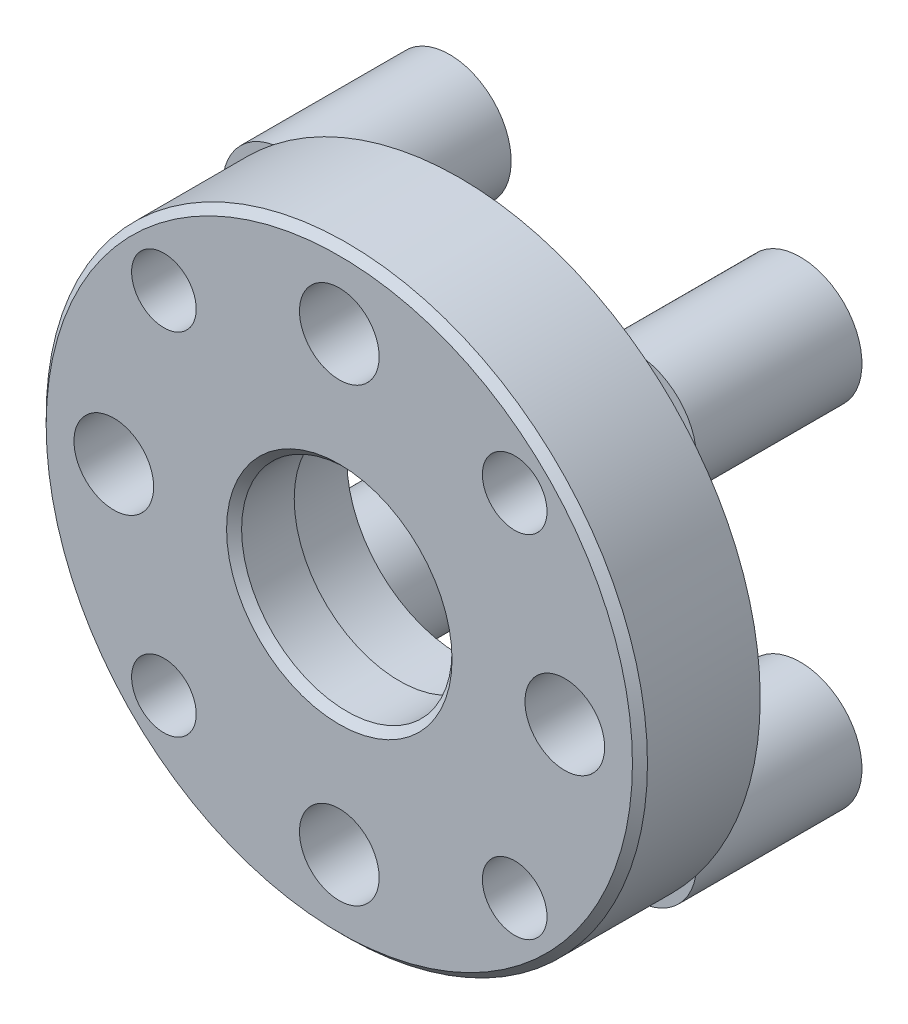
ISO-10303-21;
HEADER;
FILE_DESCRIPTION(('STEP AP214'),'2;1');
FILE_NAME('part.step','',(''),(''),'','','');
FILE_SCHEMA(('AUTOMOTIVE_DESIGN { 1 0 10303 214 1 1 1 1 }'));
ENDSEC;
DATA;
#1=APPLICATION_CONTEXT('core data for automotive mechanical design processes');
#2=APPLICATION_PROTOCOL_DEFINITION('international standard','automotive_design',2000,#1);
#3=PRODUCT_CONTEXT('',#1,'mechanical');
#4=PRODUCT('Part','Part','',(#3));
#5=PRODUCT_RELATED_PRODUCT_CATEGORY('part','',(#4));
#6=PRODUCT_DEFINITION_FORMATION('','',#4);
#7=PRODUCT_DEFINITION_CONTEXT('part definition',#1,'design');
#8=PRODUCT_DEFINITION('design','',#6,#7);
#9=PRODUCT_DEFINITION_SHAPE('','',#8);
#10=(LENGTH_UNIT() NAMED_UNIT(*) SI_UNIT(.MILLI.,.METRE.));
#11=(NAMED_UNIT(*) PLANE_ANGLE_UNIT() SI_UNIT($,.RADIAN.));
#12=(NAMED_UNIT(*) SI_UNIT($,.STERADIAN.) SOLID_ANGLE_UNIT());
#13=UNCERTAINTY_MEASURE_WITH_UNIT(LENGTH_MEASURE(1.E-05),#10,'distance_accuracy_value','');
#14=(GEOMETRIC_REPRESENTATION_CONTEXT(3) GLOBAL_UNCERTAINTY_ASSIGNED_CONTEXT((#13)) GLOBAL_UNIT_ASSIGNED_CONTEXT((#10,
#11,#12)) REPRESENTATION_CONTEXT('',''));
#15=CARTESIAN_POINT('',(0.,0.,0.));
#16=DIRECTION('',(0.,0.,1.));
#17=DIRECTION('',(1.,0.,0.));
#18=AXIS2_PLACEMENT_3D('',#15,#16,#17);
#19=CARTESIAN_POINT('',(0.,0.,33.2347367900408));
#20=DIRECTION('',(0.,0.,-1.));
#21=DIRECTION('',(-1.,0.,0.));
#22=AXIS2_PLACEMENT_3D('',#19,#20,#21);
#23=CYLINDRICAL_SURFACE('',#22,7.5);
#24=CARTESIAN_POINT('',(0.,0.,25.2347367900408));
#25=DIRECTION('',(0.,0.,1.));
#26=DIRECTION('',(1.,0.,0.));
#27=AXIS2_PLACEMENT_3D('',#24,#25,#26);
#28=CIRCLE('',#27,7.5);
#29=CARTESIAN_POINT('',(7.5,0.,25.2347367900408));
#30=VERTEX_POINT('',#29);
#31=EDGE_CURVE('E130',#30,#30,#28,.T.);
#32=ORIENTED_EDGE('',*,*,#31,.F.);
#33=EDGE_LOOP('',(#32));
#34=FACE_BOUND('',#33,.T.);
#35=CARTESIAN_POINT('',(0.,0.,29.2347367900408));
#36=DIRECTION('',(0.,0.,1.));
#37=DIRECTION('',(1.,0.,0.));
#38=AXIS2_PLACEMENT_3D('',#35,#36,#37);
#39=CIRCLE('',#38,7.5);
#40=CARTESIAN_POINT('',(7.5,0.,29.2347367900408));
#41=VERTEX_POINT('',#40);
#42=EDGE_CURVE('E342',#41,#41,#39,.T.);
#43=ORIENTED_EDGE('',*,*,#42,.T.);
#44=EDGE_LOOP('',(#43));
#45=FACE_BOUND('',#44,.T.);
#46=ADVANCED_FACE('F56',(#34,#45),#23,.F.);
#47=CARTESIAN_POINT('',(11.667261889578,-11.667261889578,14.2347367900408));
#48=DIRECTION('',(0.,0.,1.));
#49=DIRECTION('',(1.,0.,0.));
#50=AXIS2_PLACEMENT_3D('',#47,#48,#49);
#51=CYLINDRICAL_SURFACE('',#50,1.6);
#52=CARTESIAN_POINT('',(11.667261889578,-11.667261889578,17.2347367900408));
#53=DIRECTION('',(0.,0.,-1.));
#54=DIRECTION('',(-1.,0.,0.));
#55=AXIS2_PLACEMENT_3D('',#52,#53,#54);
#56=CIRCLE('',#55,1.6);
#57=CARTESIAN_POINT('',(10.067261889578,-11.667261889578,17.2347367900408));
#58=VERTEX_POINT('',#57);
#59=EDGE_CURVE('E133',#58,#58,#56,.F.);
#60=ORIENTED_EDGE('',*,*,#59,.F.);
#61=EDGE_LOOP('',(#60));
#62=FACE_BOUND('',#61,.T.);
#63=CARTESIAN_POINT('',(11.667261889578,-11.667261889578,25.2347367900408));
#64=DIRECTION('',(0.,0.,1.));
#65=DIRECTION('',(1.,0.,0.));
#66=AXIS2_PLACEMENT_3D('',#63,#64,#65);
#67=CIRCLE('',#66,1.6);
#68=CARTESIAN_POINT('',(13.267261889578,-11.667261889578,25.2347367900408));
#69=VERTEX_POINT('',#68);
#70=EDGE_CURVE('E115',#69,#69,#67,.F.);
#71=ORIENTED_EDGE('',*,*,#70,.F.);
#72=EDGE_LOOP('',(#71));
#73=FACE_BOUND('',#72,.T.);
#74=ADVANCED_FACE('F223',(#62,#73),#51,.F.);
#75=CARTESIAN_POINT('',(-11.667261889578,-11.667261889578,14.2347367900408));
#76=DIRECTION('',(0.,0.,1.));
#77=DIRECTION('',(1.,0.,0.));
#78=AXIS2_PLACEMENT_3D('',#75,#76,#77);
#79=CYLINDRICAL_SURFACE('',#78,1.6);
#80=CARTESIAN_POINT('',(-11.667261889578,-11.667261889578,17.2347367900408));
#81=DIRECTION('',(0.,0.,-1.));
#82=DIRECTION('',(-1.,0.,0.));
#83=AXIS2_PLACEMENT_3D('',#80,#81,#82);
#84=CIRCLE('',#83,1.6);
#85=CARTESIAN_POINT('',(-13.267261889578,-11.667261889578,17.2347367900408));
#86=VERTEX_POINT('',#85);
#87=EDGE_CURVE('E477',#86,#86,#84,.F.);
#88=ORIENTED_EDGE('',*,*,#87,.F.);
#89=EDGE_LOOP('',(#88));
#90=FACE_BOUND('',#89,.T.);
#91=CARTESIAN_POINT('',(-11.667261889578,-11.667261889578,25.2347367900408));
#92=DIRECTION('',(0.,0.,1.));
#93=DIRECTION('',(1.,0.,0.));
#94=AXIS2_PLACEMENT_3D('',#91,#92,#93);
#95=CIRCLE('',#94,1.6);
#96=CARTESIAN_POINT('',(-10.067261889578,-11.667261889578,25.2347367900408));
#97=VERTEX_POINT('',#96);
#98=EDGE_CURVE('E464',#97,#97,#95,.F.);
#99=ORIENTED_EDGE('',*,*,#98,.F.);
#100=EDGE_LOOP('',(#99));
#101=FACE_BOUND('',#100,.T.);
#102=ADVANCED_FACE('F231',(#90,#101),#79,.F.);
#103=CARTESIAN_POINT('',(-11.667261889578,11.667261889578,14.2347367900408));
#104=DIRECTION('',(0.,0.,1.));
#105=DIRECTION('',(1.,0.,0.));
#106=AXIS2_PLACEMENT_3D('',#103,#104,#105);
#107=CYLINDRICAL_SURFACE('',#106,1.6);
#108=CARTESIAN_POINT('',(-11.667261889578,11.667261889578,17.2347367900408));
#109=DIRECTION('',(0.,0.,-1.));
#110=DIRECTION('',(-1.,0.,0.));
#111=AXIS2_PLACEMENT_3D('',#108,#109,#110);
#112=CIRCLE('',#111,1.6);
#113=CARTESIAN_POINT('',(-13.267261889578,11.667261889578,17.2347367900408));
#114=VERTEX_POINT('',#113);
#115=EDGE_CURVE('E480',#114,#114,#112,.F.);
#116=ORIENTED_EDGE('',*,*,#115,.F.);
#117=EDGE_LOOP('',(#116));
#118=FACE_BOUND('',#117,.T.);
#119=CARTESIAN_POINT('',(-11.667261889578,11.667261889578,25.2347367900408));
#120=DIRECTION('',(0.,0.,1.));
#121=DIRECTION('',(1.,0.,0.));
#122=AXIS2_PLACEMENT_3D('',#119,#120,#121);
#123=CIRCLE('',#122,1.6);
#124=CARTESIAN_POINT('',(-10.067261889578,11.667261889578,25.2347367900408));
#125=VERTEX_POINT('',#124);
#126=EDGE_CURVE('E461',#125,#125,#123,.F.);
#127=ORIENTED_EDGE('',*,*,#126,.F.);
#128=EDGE_LOOP('',(#127));
#129=FACE_BOUND('',#128,.T.);
#130=ADVANCED_FACE('F447',(#118,#129),#107,.F.);
#131=CARTESIAN_POINT('',(11.667261889578,11.667261889578,14.2347367900408));
#132=DIRECTION('',(0.,0.,1.));
#133=DIRECTION('',(1.,0.,0.));
#134=AXIS2_PLACEMENT_3D('',#131,#132,#133);
#135=CYLINDRICAL_SURFACE('',#134,1.6);
#136=CARTESIAN_POINT('',(11.667261889578,11.667261889578,17.2347367900408));
#137=DIRECTION('',(0.,0.,-1.));
#138=DIRECTION('',(-1.,0.,0.));
#139=AXIS2_PLACEMENT_3D('',#136,#137,#138);
#140=CIRCLE('',#139,1.6);
#141=CARTESIAN_POINT('',(10.067261889578,11.667261889578,17.2347367900408));
#142=VERTEX_POINT('',#141);
#143=EDGE_CURVE('E181',#142,#142,#140,.F.);
#144=ORIENTED_EDGE('',*,*,#143,.F.);
#145=EDGE_LOOP('',(#144));
#146=FACE_BOUND('',#145,.T.);
#147=CARTESIAN_POINT('',(11.667261889578,11.667261889578,25.2347367900408));
#148=DIRECTION('',(0.,0.,1.));
#149=DIRECTION('',(1.,0.,0.));
#150=AXIS2_PLACEMENT_3D('',#147,#148,#149);
#151=CIRCLE('',#150,1.6);
#152=CARTESIAN_POINT('',(13.267261889578,11.667261889578,25.2347367900408));
#153=VERTEX_POINT('',#152);
#154=EDGE_CURVE('E313',#153,#153,#151,.F.);
#155=ORIENTED_EDGE('',*,*,#154,.F.);
#156=EDGE_LOOP('',(#155));
#157=FACE_BOUND('',#156,.T.);
#158=ADVANCED_FACE('F190',(#146,#157),#135,.F.);
#159=CARTESIAN_POINT('',(11.667261889578,11.667261889578,14.2347367900408));
#160=DIRECTION('',(0.,0.,-1.));
#161=DIRECTION('',(-1.,0.,0.));
#162=AXIS2_PLACEMENT_3D('',#159,#160,#161);
#163=PLANE('',#162);
#164=CARTESIAN_POINT('',(11.667261889578,11.667261889578,14.2347367900408));
#165=DIRECTION('',(0.,0.,-1.));
#166=DIRECTION('',(-1.,0.,0.));
#167=AXIS2_PLACEMENT_3D('',#164,#165,#166);
#168=CIRCLE('',#167,3.);
#169=CARTESIAN_POINT('',(8.66726188957803,11.667261889578,14.2347367900408));
#170=VERTEX_POINT('',#169);
#171=EDGE_CURVE('E163',#170,#170,#168,.T.);
#172=ORIENTED_EDGE('',*,*,#171,.F.);
#173=EDGE_LOOP('',(#172));
#174=FACE_BOUND('',#173,.T.);
#175=CARTESIAN_POINT('',(11.667261889578,11.667261889578,14.2347367900408));
#176=DIRECTION('',(0.,0.,-1.));
#177=DIRECTION('',(-1.,0.,0.));
#178=AXIS2_PLACEMENT_3D('',#175,#176,#177);
#179=CIRCLE('',#178,4.1);
#180=CARTESIAN_POINT('',(7.56726188957803,11.667261889578,14.2347367900408));
#181=VERTEX_POINT('',#180);
#182=EDGE_CURVE('E118',#181,#181,#179,.T.);
#183=ORIENTED_EDGE('',*,*,#182,.T.);
#184=EDGE_LOOP('',(#183));
#185=FACE_BOUND('',#184,.T.);
#186=ADVANCED_FACE('F187',(#174,#185),#163,.T.);
#187=CARTESIAN_POINT('',(11.667261889578,11.667261889578,25.2347367900408));
#188=DIRECTION('',(0.,0.,-1.));
#189=DIRECTION('',(-1.,0.,0.));
#190=AXIS2_PLACEMENT_3D('',#187,#188,#189);
#191=PLANE('',#190);
#192=CARTESIAN_POINT('',(0.,0.,25.2347367900408));
#193=DIRECTION('',(0.,0.,1.));
#194=DIRECTION('',(1.,0.,0.));
#195=AXIS2_PLACEMENT_3D('',#192,#193,#194);
#196=CIRCLE('',#195,20.);
#197=CARTESIAN_POINT('',(15.7039712173582,12.3848814287576,25.2347367900408));
#198=VERTEX_POINT('',#197);
#199=CARTESIAN_POINT('',(12.3848814287576,15.7039712173582,25.2347367900408));
#200=VERTEX_POINT('',#199);
#201=EDGE_CURVE('E95',#198,#200,#196,.T.);
#202=ORIENTED_EDGE('',*,*,#201,.F.);
#203=CARTESIAN_POINT('',(11.667261889578,11.667261889578,25.2347367900408));
#204=DIRECTION('',(0.,0.,-1.));
#205=DIRECTION('',(-1.,0.,0.));
#206=AXIS2_PLACEMENT_3D('',#203,#204,#205);
#207=CIRCLE('',#206,4.1);
#208=EDGE_CURVE('E113',#200,#198,#207,.T.);
#209=ORIENTED_EDGE('',*,*,#208,.F.);
#210=EDGE_LOOP('',(#202,#209));
#211=FACE_BOUND('',#210,.T.);
#212=ADVANCED_FACE('F117',(#211),#191,.F.);
#213=CARTESIAN_POINT('',(0.,0.,33.2347367900408));
#214=DIRECTION('',(0.,0.,1.));
#215=DIRECTION('',(1.,0.,0.));
#216=AXIS2_PLACEMENT_3D('',#213,#214,#215);
#217=PLANE('',#216);
#218=CARTESIAN_POINT('',(0.,0.,33.2347367900408));
#219=DIRECTION('',(0.,0.,1.));
#220=DIRECTION('',(1.,0.,0.));
#221=AXIS2_PLACEMENT_3D('',#218,#219,#220);
#222=CIRCLE('',#221,7.49999999999999);
#223=CARTESIAN_POINT('',(7.49999999999999,0.,33.2347367900408));
#224=VERTEX_POINT('',#223);
#225=EDGE_CURVE('E65',#224,#224,#222,.F.);
#226=ORIENTED_EDGE('',*,*,#225,.T.);
#227=EDGE_LOOP('',(#226));
#228=FACE_BOUND('',#227,.T.);
#229=CARTESIAN_POINT('',(0.,0.,33.2347367900408));
#230=DIRECTION('',(0.,0.,1.));
#231=DIRECTION('',(1.,0.,0.));
#232=AXIS2_PLACEMENT_3D('',#229,#230,#231);
#233=CIRCLE('',#232,19.5);
#234=CARTESIAN_POINT('',(19.5,0.,33.2347367900408));
#235=VERTEX_POINT('',#234);
#236=EDGE_CURVE('E271',#235,#235,#233,.T.);
#237=ORIENTED_EDGE('',*,*,#236,.T.);
#238=EDGE_LOOP('',(#237));
#239=FACE_BOUND('',#238,.T.);
#240=CARTESIAN_POINT('',(15.,0.,33.2347367900408));
#241=DIRECTION('',(0.,0.,1.));
#242=DIRECTION('',(1.,0.,0.));
#243=AXIS2_PLACEMENT_3D('',#240,#241,#242);
#244=CIRCLE('',#243,2.65);
#245=CARTESIAN_POINT('',(17.65,0.,33.2347367900408));
#246=VERTEX_POINT('',#245);
#247=EDGE_CURVE('E283',#246,#246,#244,.T.);
#248=ORIENTED_EDGE('',*,*,#247,.F.);
#249=EDGE_LOOP('',(#248));
#250=FACE_BOUND('',#249,.T.);
#251=CARTESIAN_POINT('',(-1.04744440165294E-13,-15.,33.2347367900408));
#252=DIRECTION('',(0.,0.,1.));
#253=DIRECTION('',(1.,0.,0.));
#254=AXIS2_PLACEMENT_3D('',#251,#252,#253);
#255=CIRCLE('',#254,2.65);
#256=CARTESIAN_POINT('',(2.64999999999989,-15.,33.2347367900408));
#257=VERTEX_POINT('',#256);
#258=EDGE_CURVE('E287',#257,#257,#255,.T.);
#259=ORIENTED_EDGE('',*,*,#258,.F.);
#260=EDGE_LOOP('',(#259));
#261=FACE_BOUND('',#260,.T.);
#262=CARTESIAN_POINT('',(-15.,1.57116660247941E-13,33.2347367900408));
#263=DIRECTION('',(0.,0.,1.));
#264=DIRECTION('',(1.,0.,0.));
#265=AXIS2_PLACEMENT_3D('',#262,#263,#264);
#266=CIRCLE('',#265,2.65);
#267=CARTESIAN_POINT('',(-12.35,1.57116660247941E-13,33.2347367900408));
#268=VERTEX_POINT('',#267);
#269=EDGE_CURVE('E291',#268,#268,#266,.T.);
#270=ORIENTED_EDGE('',*,*,#269,.F.);
#271=EDGE_LOOP('',(#270));
#272=FACE_BOUND('',#271,.T.);
#273=CARTESIAN_POINT('',(-11.667261889578,11.667261889578,33.2347367900408));
#274=DIRECTION('',(0.,0.,1.));
#275=DIRECTION('',(1.,0.,0.));
#276=AXIS2_PLACEMENT_3D('',#273,#274,#275);
#277=CIRCLE('',#276,2.15);
#278=CARTESIAN_POINT('',(-9.51726188957804,11.667261889578,33.2347367900408));
#279=VERTEX_POINT('',#278);
#280=EDGE_CURVE('E295',#279,#279,#277,.T.);
#281=ORIENTED_EDGE('',*,*,#280,.F.);
#282=EDGE_LOOP('',(#281));
#283=FACE_BOUND('',#282,.T.);
#284=CARTESIAN_POINT('',(11.667261889578,11.667261889578,33.2347367900408));
#285=DIRECTION('',(0.,0.,1.));
#286=DIRECTION('',(1.,0.,0.));
#287=AXIS2_PLACEMENT_3D('',#284,#285,#286);
#288=CIRCLE('',#287,2.15);
#289=CARTESIAN_POINT('',(13.817261889578,11.667261889578,33.2347367900408));
#290=VERTEX_POINT('',#289);
#291=EDGE_CURVE('E299',#290,#290,#288,.T.);
#292=ORIENTED_EDGE('',*,*,#291,.F.);
#293=EDGE_LOOP('',(#292));
#294=FACE_BOUND('',#293,.T.);
#295=CARTESIAN_POINT('',(11.667261889578,-11.667261889578,33.2347367900408));
#296=DIRECTION('',(0.,0.,1.));
#297=DIRECTION('',(1.,0.,0.));
#298=AXIS2_PLACEMENT_3D('',#295,#296,#297);
#299=CIRCLE('',#298,2.15);
#300=CARTESIAN_POINT('',(13.817261889578,-11.667261889578,33.2347367900408));
#301=VERTEX_POINT('',#300);
#302=EDGE_CURVE('E303',#301,#301,#299,.T.);
#303=ORIENTED_EDGE('',*,*,#302,.F.);
#304=EDGE_LOOP('',(#303));
#305=FACE_BOUND('',#304,.T.);
#306=CARTESIAN_POINT('',(-11.667261889578,-11.667261889578,33.2347367900408));
#307=DIRECTION('',(0.,0.,1.));
#308=DIRECTION('',(1.,0.,0.));
#309=AXIS2_PLACEMENT_3D('',#306,#307,#308);
#310=CIRCLE('',#309,2.15);
#311=CARTESIAN_POINT('',(-9.51726188957803,-11.667261889578,33.2347367900408));
#312=VERTEX_POINT('',#311);
#313=EDGE_CURVE('E307',#312,#312,#310,.T.);
#314=ORIENTED_EDGE('',*,*,#313,.F.);
#315=EDGE_LOOP('',(#314));
#316=FACE_BOUND('',#315,.T.);
#317=CARTESIAN_POINT('',(0.,15.,33.2347367900408));
#318=DIRECTION('',(0.,0.,1.));
#319=DIRECTION('',(1.,0.,0.));
#320=AXIS2_PLACEMENT_3D('',#317,#318,#319);
#321=CIRCLE('',#320,2.65);
#322=CARTESIAN_POINT('',(2.65,15.,33.2347367900408));
#323=VERTEX_POINT('',#322);
#324=EDGE_CURVE('E199',#323,#323,#321,.T.);
#325=ORIENTED_EDGE('',*,*,#324,.F.);
#326=EDGE_LOOP('',(#325));
#327=FACE_BOUND('',#326,.T.);
#328=ADVANCED_FACE('F240',(#228,#239,#250,#261,#272,#283,#294,#305,#316,#327),#217,.T.);
#329=CARTESIAN_POINT('',(0.,0.,25.2347367900408));
#330=DIRECTION('',(0.,0.,1.));
#331=DIRECTION('',(1.,0.,0.));
#332=AXIS2_PLACEMENT_3D('',#329,#330,#331);
#333=PLANE('',#332);
#334=CARTESIAN_POINT('',(15.,0.,25.2347367900408));
#335=DIRECTION('',(0.,0.,1.));
#336=DIRECTION('',(1.,0.,0.));
#337=AXIS2_PLACEMENT_3D('',#334,#335,#336);
#338=CIRCLE('',#337,2.65);
#339=CARTESIAN_POINT('',(17.65,0.,25.2347367900408));
#340=VERTEX_POINT('',#339);
#341=EDGE_CURVE('E314',#340,#340,#338,.T.);
#342=ORIENTED_EDGE('',*,*,#341,.T.);
#343=EDGE_LOOP('',(#342));
#344=FACE_BOUND('',#343,.T.);
#345=CARTESIAN_POINT('',(-1.04744440165294E-13,-15.,25.2347367900408));
#346=DIRECTION('',(0.,0.,1.));
#347=DIRECTION('',(1.,0.,0.));
#348=AXIS2_PLACEMENT_3D('',#345,#346,#347);
#349=CIRCLE('',#348,2.65);
#350=CARTESIAN_POINT('',(2.64999999999989,-15.,25.2347367900408));
#351=VERTEX_POINT('',#350);
#352=EDGE_CURVE('E324',#351,#351,#349,.T.);
#353=ORIENTED_EDGE('',*,*,#352,.T.);
#354=EDGE_LOOP('',(#353));
#355=FACE_BOUND('',#354,.T.);
#356=CARTESIAN_POINT('',(-15.,1.57116660247941E-13,25.2347367900408));
#357=DIRECTION('',(0.,0.,1.));
#358=DIRECTION('',(1.,0.,0.));
#359=AXIS2_PLACEMENT_3D('',#356,#357,#358);
#360=CIRCLE('',#359,2.65);
#361=CARTESIAN_POINT('',(-12.35,1.57116660247941E-13,25.2347367900408));
#362=VERTEX_POINT('',#361);
#363=EDGE_CURVE('E328',#362,#362,#360,.T.);
#364=ORIENTED_EDGE('',*,*,#363,.T.);
#365=EDGE_LOOP('',(#364));
#366=FACE_BOUND('',#365,.T.);
#367=CARTESIAN_POINT('',(0.,15.,25.2347367900408));
#368=DIRECTION('',(0.,0.,1.));
#369=DIRECTION('',(1.,0.,0.));
#370=AXIS2_PLACEMENT_3D('',#367,#368,#369);
#371=CIRCLE('',#370,2.65);
#372=CARTESIAN_POINT('',(2.65,15.,25.2347367900408));
#373=VERTEX_POINT('',#372);
#374=EDGE_CURVE('E311',#373,#373,#371,.T.);
#375=ORIENTED_EDGE('',*,*,#374,.T.);
#376=EDGE_LOOP('',(#375));
#377=FACE_BOUND('',#376,.T.);
#378=CARTESIAN_POINT('',(-12.3848814287576,15.7039712173582,25.2347367900408));
#379=VERTEX_POINT('',#378);
#380=EDGE_CURVE('E99',#200,#379,#196,.T.);
#381=ORIENTED_EDGE('',*,*,#380,.F.);
#382=EDGE_CURVE('E110',#198,#200,#207,.T.);
#383=ORIENTED_EDGE('',*,*,#382,.F.);
#384=CARTESIAN_POINT('',(15.7039712173582,-12.3848814287576,25.2347367900408));
#385=VERTEX_POINT('',#384);
#386=EDGE_CURVE('E101',#385,#198,#196,.T.);
#387=ORIENTED_EDGE('',*,*,#386,.F.);
#388=CARTESIAN_POINT('',(11.667261889578,-11.667261889578,25.2347367900408));
#389=DIRECTION('',(0.,0.,-1.));
#390=DIRECTION('',(-1.,0.,0.));
#391=AXIS2_PLACEMENT_3D('',#388,#389,#390);
#392=CIRCLE('',#391,4.1);
#393=CARTESIAN_POINT('',(12.3848814287576,-15.7039712173582,25.2347367900408));
#394=VERTEX_POINT('',#393);
#395=EDGE_CURVE('E194',#394,#385,#392,.T.);
#396=ORIENTED_EDGE('',*,*,#395,.F.);
#397=CARTESIAN_POINT('',(-12.3848814287575,-15.7039712173582,25.2347367900408));
#398=VERTEX_POINT('',#397);
#399=EDGE_CURVE('E131',#398,#394,#196,.T.);
#400=ORIENTED_EDGE('',*,*,#399,.F.);
#401=CARTESIAN_POINT('',(-11.667261889578,-11.667261889578,25.2347367900408));
#402=DIRECTION('',(0.,0.,-1.));
#403=DIRECTION('',(-1.,0.,0.));
#404=AXIS2_PLACEMENT_3D('',#401,#402,#403);
#405=CIRCLE('',#404,4.1);
#406=CARTESIAN_POINT('',(-15.7039712173582,-12.3848814287576,25.2347367900408));
#407=VERTEX_POINT('',#406);
#408=EDGE_CURVE('E145',#407,#398,#405,.T.);
#409=ORIENTED_EDGE('',*,*,#408,.F.);
#410=CARTESIAN_POINT('',(-15.7039712173583,12.3848814287575,25.2347367900408));
#411=VERTEX_POINT('',#410);
#412=EDGE_CURVE('E126',#411,#407,#196,.T.);
#413=ORIENTED_EDGE('',*,*,#412,.F.);
#414=CARTESIAN_POINT('',(-11.667261889578,11.667261889578,25.2347367900408));
#415=DIRECTION('',(0.,0.,-1.));
#416=DIRECTION('',(-1.,0.,0.));
#417=AXIS2_PLACEMENT_3D('',#414,#415,#416);
#418=CIRCLE('',#417,4.1);
#419=EDGE_CURVE('E124',#379,#411,#418,.T.);
#420=ORIENTED_EDGE('',*,*,#419,.F.);
#421=EDGE_LOOP('',(#381,#383,#387,#396,#400,#409,#413,#420));
#422=FACE_BOUND('',#421,.T.);
#423=ORIENTED_EDGE('',*,*,#31,.T.);
#424=EDGE_LOOP('',(#423));
#425=FACE_BOUND('',#424,.T.);
#426=ADVANCED_FACE('F120',(#344,#355,#366,#377,#422,#425),#333,.F.);
#427=CARTESIAN_POINT('',(0.,0.,33.2347367900408));
#428=DIRECTION('',(0.,0.,-1.));
#429=DIRECTION('',(-1.,0.,0.));
#430=AXIS2_PLACEMENT_3D('',#427,#428,#429);
#431=CYLINDRICAL_SURFACE('',#430,20.);
#432=CARTESIAN_POINT('',(0.,0.,32.7347367900408));
#433=DIRECTION('',(0.,0.,1.));
#434=DIRECTION('',(1.,0.,0.));
#435=AXIS2_PLACEMENT_3D('',#432,#433,#434);
#436=CIRCLE('',#435,20.);
#437=CARTESIAN_POINT('',(20.,0.,32.7347367900408));
#438=VERTEX_POINT('',#437);
#439=EDGE_CURVE('E12',#438,#438,#436,.F.);
#440=ORIENTED_EDGE('',*,*,#439,.T.);
#441=EDGE_LOOP('',(#440));
#442=FACE_BOUND('',#441,.T.);
#443=ORIENTED_EDGE('',*,*,#201,.T.);
#444=ORIENTED_EDGE('',*,*,#380,.T.);
#445=EDGE_CURVE('E107',#379,#411,#196,.T.);
#446=ORIENTED_EDGE('',*,*,#445,.T.);
#447=ORIENTED_EDGE('',*,*,#412,.T.);
#448=EDGE_CURVE('E127',#407,#398,#196,.T.);
#449=ORIENTED_EDGE('',*,*,#448,.T.);
#450=ORIENTED_EDGE('',*,*,#399,.T.);
#451=EDGE_CURVE('E72',#394,#385,#196,.T.);
#452=ORIENTED_EDGE('',*,*,#451,.T.);
#453=ORIENTED_EDGE('',*,*,#386,.T.);
#454=EDGE_LOOP('',(#443,#444,#446,#447,#449,#450,#452,#453));
#455=FACE_BOUND('',#454,.T.);
#456=ADVANCED_FACE('F97',(#442,#455),#431,.T.);
#457=CARTESIAN_POINT('',(-11.667261889578,11.667261889578,14.2347367900408));
#458=DIRECTION('',(0.,0.,-1.));
#459=DIRECTION('',(-1.,0.,0.));
#460=AXIS2_PLACEMENT_3D('',#457,#458,#459);
#461=PLANE('',#460);
#462=CARTESIAN_POINT('',(-11.667261889578,11.667261889578,14.2347367900408));
#463=DIRECTION('',(0.,0.,-1.));
#464=DIRECTION('',(-1.,0.,0.));
#465=AXIS2_PLACEMENT_3D('',#462,#463,#464);
#466=CIRCLE('',#465,3.);
#467=CARTESIAN_POINT('',(-14.667261889578,11.667261889578,14.2347367900408));
#468=VERTEX_POINT('',#467);
#469=EDGE_CURVE('E173',#468,#468,#466,.T.);
#470=ORIENTED_EDGE('',*,*,#469,.F.);
#471=EDGE_LOOP('',(#470));
#472=FACE_BOUND('',#471,.T.);
#473=CARTESIAN_POINT('',(-11.667261889578,11.667261889578,14.2347367900408));
#474=DIRECTION('',(0.,0.,-1.));
#475=DIRECTION('',(-1.,0.,0.));
#476=AXIS2_PLACEMENT_3D('',#473,#474,#475);
#477=CIRCLE('',#476,4.1);
#478=CARTESIAN_POINT('',(-15.767261889578,11.667261889578,14.2347367900408));
#479=VERTEX_POINT('',#478);
#480=EDGE_CURVE('E150',#479,#479,#477,.T.);
#481=ORIENTED_EDGE('',*,*,#480,.T.);
#482=EDGE_LOOP('',(#481));
#483=FACE_BOUND('',#482,.T.);
#484=ADVANCED_FACE('F238',(#472,#483),#461,.T.);
#485=CARTESIAN_POINT('',(-11.667261889578,11.667261889578,25.2347367900408));
#486=DIRECTION('',(0.,0.,-1.));
#487=DIRECTION('',(-1.,0.,0.));
#488=AXIS2_PLACEMENT_3D('',#485,#486,#487);
#489=PLANE('',#488);
#490=ORIENTED_EDGE('',*,*,#445,.F.);
#491=EDGE_CURVE('E155',#411,#379,#418,.T.);
#492=ORIENTED_EDGE('',*,*,#491,.F.);
#493=EDGE_LOOP('',(#490,#492));
#494=FACE_BOUND('',#493,.T.);
#495=ADVANCED_FACE('F680',(#494),#489,.F.);
#496=CARTESIAN_POINT('',(-11.667261889578,-11.667261889578,14.2347367900408));
#497=DIRECTION('',(0.,0.,-1.));
#498=DIRECTION('',(-1.,0.,0.));
#499=AXIS2_PLACEMENT_3D('',#496,#497,#498);
#500=PLANE('',#499);
#501=CARTESIAN_POINT('',(-11.667261889578,-11.667261889578,14.2347367900408));
#502=DIRECTION('',(0.,0.,-1.));
#503=DIRECTION('',(-1.,0.,0.));
#504=AXIS2_PLACEMENT_3D('',#501,#502,#503);
#505=CIRCLE('',#504,3.);
#506=CARTESIAN_POINT('',(-14.667261889578,-11.667261889578,14.2347367900408));
#507=VERTEX_POINT('',#506);
#508=EDGE_CURVE('E167',#507,#507,#505,.T.);
#509=ORIENTED_EDGE('',*,*,#508,.F.);
#510=EDGE_LOOP('',(#509));
#511=FACE_BOUND('',#510,.T.);
#512=CARTESIAN_POINT('',(-11.667261889578,-11.667261889578,14.2347367900408));
#513=DIRECTION('',(0.,0.,-1.));
#514=DIRECTION('',(-1.,0.,0.));
#515=AXIS2_PLACEMENT_3D('',#512,#513,#514);
#516=CIRCLE('',#515,4.1);
#517=CARTESIAN_POINT('',(-15.767261889578,-11.667261889578,14.2347367900408));
#518=VERTEX_POINT('',#517);
#519=EDGE_CURVE('E147',#518,#518,#516,.T.);
#520=ORIENTED_EDGE('',*,*,#519,.T.);
#521=EDGE_LOOP('',(#520));
#522=FACE_BOUND('',#521,.T.);
#523=ADVANCED_FACE('F689',(#511,#522),#500,.T.);
#524=CARTESIAN_POINT('',(-11.667261889578,-11.667261889578,25.2347367900408));
#525=DIRECTION('',(0.,0.,-1.));
#526=DIRECTION('',(-1.,0.,0.));
#527=AXIS2_PLACEMENT_3D('',#524,#525,#526);
#528=PLANE('',#527);
#529=ORIENTED_EDGE('',*,*,#448,.F.);
#530=EDGE_CURVE('E142',#398,#407,#405,.T.);
#531=ORIENTED_EDGE('',*,*,#530,.F.);
#532=EDGE_LOOP('',(#529,#531));
#533=FACE_BOUND('',#532,.T.);
#534=ADVANCED_FACE('F218',(#533),#528,.F.);
#535=CARTESIAN_POINT('',(11.667261889578,-11.667261889578,14.2347367900408));
#536=DIRECTION('',(0.,0.,-1.));
#537=DIRECTION('',(-1.,0.,0.));
#538=AXIS2_PLACEMENT_3D('',#535,#536,#537);
#539=PLANE('',#538);
#540=CARTESIAN_POINT('',(11.667261889578,-11.667261889578,14.2347367900408));
#541=DIRECTION('',(0.,0.,-1.));
#542=DIRECTION('',(-1.,0.,0.));
#543=AXIS2_PLACEMENT_3D('',#540,#541,#542);
#544=CIRCLE('',#543,3.);
#545=CARTESIAN_POINT('',(8.66726188957804,-11.667261889578,14.2347367900408));
#546=VERTEX_POINT('',#545);
#547=EDGE_CURVE('E160',#546,#546,#544,.T.);
#548=ORIENTED_EDGE('',*,*,#547,.F.);
#549=EDGE_LOOP('',(#548));
#550=FACE_BOUND('',#549,.T.);
#551=CARTESIAN_POINT('',(11.667261889578,-11.667261889578,14.2347367900408));
#552=DIRECTION('',(0.,0.,-1.));
#553=DIRECTION('',(-1.,0.,0.));
#554=AXIS2_PLACEMENT_3D('',#551,#552,#553);
#555=CIRCLE('',#554,4.1);
#556=CARTESIAN_POINT('',(7.56726188957804,-11.667261889578,14.2347367900408));
#557=VERTEX_POINT('',#556);
#558=EDGE_CURVE('E152',#557,#557,#555,.T.);
#559=ORIENTED_EDGE('',*,*,#558,.T.);
#560=EDGE_LOOP('',(#559));
#561=FACE_BOUND('',#560,.T.);
#562=ADVANCED_FACE('F209',(#550,#561),#539,.T.);
#563=CARTESIAN_POINT('',(11.667261889578,-11.667261889578,25.2347367900408));
#564=DIRECTION('',(0.,0.,-1.));
#565=DIRECTION('',(-1.,0.,0.));
#566=AXIS2_PLACEMENT_3D('',#563,#564,#565);
#567=PLANE('',#566);
#568=ORIENTED_EDGE('',*,*,#451,.F.);
#569=EDGE_CURVE('E197',#385,#394,#392,.T.);
#570=ORIENTED_EDGE('',*,*,#569,.F.);
#571=EDGE_LOOP('',(#568,#570));
#572=FACE_BOUND('',#571,.T.);
#573=ADVANCED_FACE('F206',(#572),#567,.F.);
#574=CARTESIAN_POINT('',(11.667261889578,11.667261889578,17.2347367900408));
#575=DIRECTION('',(0.,0.,-1.));
#576=DIRECTION('',(-1.,0.,0.));
#577=AXIS2_PLACEMENT_3D('',#574,#575,#576);
#578=PLANE('',#577);
#579=CARTESIAN_POINT('',(11.667261889578,11.667261889578,17.2347367900408));
#580=DIRECTION('',(0.,0.,-1.));
#581=DIRECTION('',(-1.,0.,0.));
#582=AXIS2_PLACEMENT_3D('',#579,#580,#581);
#583=CIRCLE('',#582,3.);
#584=CARTESIAN_POINT('',(8.66726188957803,11.667261889578,17.2347367900408));
#585=VERTEX_POINT('',#584);
#586=EDGE_CURVE('E178',#585,#585,#583,.T.);
#587=ORIENTED_EDGE('',*,*,#586,.T.);
#588=EDGE_LOOP('',(#587));
#589=FACE_BOUND('',#588,.T.);
#590=ORIENTED_EDGE('',*,*,#143,.T.);
#591=EDGE_LOOP('',(#590));
#592=FACE_BOUND('',#591,.T.);
#593=ADVANCED_FACE('F208',(#589,#592),#578,.T.);
#594=CARTESIAN_POINT('',(11.667261889578,11.667261889578,17.2347367900408));
#595=DIRECTION('',(0.,0.,-1.));
#596=DIRECTION('',(-1.,0.,0.));
#597=AXIS2_PLACEMENT_3D('',#594,#595,#596);
#598=CYLINDRICAL_SURFACE('',#597,3.);
#599=ORIENTED_EDGE('',*,*,#586,.F.);
#600=EDGE_LOOP('',(#599));
#601=FACE_BOUND('',#600,.T.);
#602=ORIENTED_EDGE('',*,*,#171,.T.);
#603=EDGE_LOOP('',(#602));
#604=FACE_BOUND('',#603,.T.);
#605=ADVANCED_FACE('F185',(#601,#604),#598,.F.);
#606=CARTESIAN_POINT('',(-11.667261889578,11.667261889578,17.2347367900408));
#607=DIRECTION('',(0.,0.,-1.));
#608=DIRECTION('',(-1.,0.,0.));
#609=AXIS2_PLACEMENT_3D('',#606,#607,#608);
#610=PLANE('',#609);
#611=CARTESIAN_POINT('',(-11.667261889578,11.667261889578,17.2347367900408));
#612=DIRECTION('',(0.,0.,-1.));
#613=DIRECTION('',(-1.,0.,0.));
#614=AXIS2_PLACEMENT_3D('',#611,#612,#613);
#615=CIRCLE('',#614,3.);
#616=CARTESIAN_POINT('',(-14.667261889578,11.667261889578,17.2347367900408));
#617=VERTEX_POINT('',#616);
#618=EDGE_CURVE('E157',#617,#617,#615,.T.);
#619=ORIENTED_EDGE('',*,*,#618,.T.);
#620=EDGE_LOOP('',(#619));
#621=FACE_BOUND('',#620,.T.);
#622=ORIENTED_EDGE('',*,*,#115,.T.);
#623=EDGE_LOOP('',(#622));
#624=FACE_BOUND('',#623,.T.);
#625=ADVANCED_FACE('F437',(#621,#624),#610,.T.);
#626=CARTESIAN_POINT('',(-11.667261889578,11.667261889578,17.2347367900408));
#627=DIRECTION('',(0.,0.,-1.));
#628=DIRECTION('',(-1.,0.,0.));
#629=AXIS2_PLACEMENT_3D('',#626,#627,#628);
#630=CYLINDRICAL_SURFACE('',#629,3.);
#631=ORIENTED_EDGE('',*,*,#618,.F.);
#632=EDGE_LOOP('',(#631));
#633=FACE_BOUND('',#632,.T.);
#634=ORIENTED_EDGE('',*,*,#469,.T.);
#635=EDGE_LOOP('',(#634));
#636=FACE_BOUND('',#635,.T.);
#637=ADVANCED_FACE('F433',(#633,#636),#630,.F.);
#638=CARTESIAN_POINT('',(-11.667261889578,-11.667261889578,17.2347367900408));
#639=DIRECTION('',(0.,0.,-1.));
#640=DIRECTION('',(-1.,0.,0.));
#641=AXIS2_PLACEMENT_3D('',#638,#639,#640);
#642=PLANE('',#641);
#643=CARTESIAN_POINT('',(-11.667261889578,-11.667261889578,17.2347367900408));
#644=DIRECTION('',(0.,0.,-1.));
#645=DIRECTION('',(-1.,0.,0.));
#646=AXIS2_PLACEMENT_3D('',#643,#644,#645);
#647=CIRCLE('',#646,3.);
#648=CARTESIAN_POINT('',(-14.667261889578,-11.667261889578,17.2347367900408));
#649=VERTEX_POINT('',#648);
#650=EDGE_CURVE('E170',#649,#649,#647,.T.);
#651=ORIENTED_EDGE('',*,*,#650,.T.);
#652=EDGE_LOOP('',(#651));
#653=FACE_BOUND('',#652,.T.);
#654=ORIENTED_EDGE('',*,*,#87,.T.);
#655=EDGE_LOOP('',(#654));
#656=FACE_BOUND('',#655,.T.);
#657=ADVANCED_FACE('F429',(#653,#656),#642,.T.);
#658=CARTESIAN_POINT('',(-11.667261889578,-11.667261889578,17.2347367900408));
#659=DIRECTION('',(0.,0.,-1.));
#660=DIRECTION('',(-1.,0.,0.));
#661=AXIS2_PLACEMENT_3D('',#658,#659,#660);
#662=CYLINDRICAL_SURFACE('',#661,3.);
#663=ORIENTED_EDGE('',*,*,#650,.F.);
#664=EDGE_LOOP('',(#663));
#665=FACE_BOUND('',#664,.T.);
#666=ORIENTED_EDGE('',*,*,#508,.T.);
#667=EDGE_LOOP('',(#666));
#668=FACE_BOUND('',#667,.T.);
#669=ADVANCED_FACE('F425',(#665,#668),#662,.F.);
#670=CARTESIAN_POINT('',(11.667261889578,-11.667261889578,17.2347367900408));
#671=DIRECTION('',(0.,0.,-1.));
#672=DIRECTION('',(-1.,0.,0.));
#673=AXIS2_PLACEMENT_3D('',#670,#671,#672);
#674=PLANE('',#673);
#675=CARTESIAN_POINT('',(11.667261889578,-11.667261889578,17.2347367900408));
#676=DIRECTION('',(0.,0.,-1.));
#677=DIRECTION('',(-1.,0.,0.));
#678=AXIS2_PLACEMENT_3D('',#675,#676,#677);
#679=CIRCLE('',#678,3.);
#680=CARTESIAN_POINT('',(8.66726188957804,-11.667261889578,17.2347367900408));
#681=VERTEX_POINT('',#680);
#682=EDGE_CURVE('E164',#681,#681,#679,.T.);
#683=ORIENTED_EDGE('',*,*,#682,.T.);
#684=EDGE_LOOP('',(#683));
#685=FACE_BOUND('',#684,.T.);
#686=ORIENTED_EDGE('',*,*,#59,.T.);
#687=EDGE_LOOP('',(#686));
#688=FACE_BOUND('',#687,.T.);
#689=ADVANCED_FACE('F421',(#685,#688),#674,.T.);
#690=CARTESIAN_POINT('',(11.667261889578,-11.667261889578,17.2347367900408));
#691=DIRECTION('',(0.,0.,-1.));
#692=DIRECTION('',(-1.,0.,0.));
#693=AXIS2_PLACEMENT_3D('',#690,#691,#692);
#694=CYLINDRICAL_SURFACE('',#693,3.);
#695=ORIENTED_EDGE('',*,*,#682,.F.);
#696=EDGE_LOOP('',(#695));
#697=FACE_BOUND('',#696,.T.);
#698=ORIENTED_EDGE('',*,*,#547,.T.);
#699=EDGE_LOOP('',(#698));
#700=FACE_BOUND('',#699,.T.);
#701=ADVANCED_FACE('F417',(#697,#700),#694,.F.);
#702=CARTESIAN_POINT('',(-11.667261889578,11.667261889578,25.2347367900408));
#703=DIRECTION('',(0.,0.,-1.));
#704=DIRECTION('',(-1.,0.,0.));
#705=AXIS2_PLACEMENT_3D('',#702,#703,#704);
#706=CYLINDRICAL_SURFACE('',#705,4.1);
#707=ORIENTED_EDGE('',*,*,#491,.T.);
#708=ORIENTED_EDGE('',*,*,#419,.T.);
#709=EDGE_LOOP('',(#707,#708));
#710=FACE_BOUND('',#709,.T.);
#711=ORIENTED_EDGE('',*,*,#480,.F.);
#712=EDGE_LOOP('',(#711));
#713=FACE_BOUND('',#712,.T.);
#714=ADVANCED_FACE('F415',(#710,#713),#706,.T.);
#715=CARTESIAN_POINT('',(-11.667261889578,-11.667261889578,25.2347367900408));
#716=DIRECTION('',(0.,0.,-1.));
#717=DIRECTION('',(-1.,0.,0.));
#718=AXIS2_PLACEMENT_3D('',#715,#716,#717);
#719=CYLINDRICAL_SURFACE('',#718,4.1);
#720=ORIENTED_EDGE('',*,*,#530,.T.);
#721=ORIENTED_EDGE('',*,*,#408,.T.);
#722=EDGE_LOOP('',(#720,#721));
#723=FACE_BOUND('',#722,.T.);
#724=ORIENTED_EDGE('',*,*,#519,.F.);
#725=EDGE_LOOP('',(#724));
#726=FACE_BOUND('',#725,.T.);
#727=ADVANCED_FACE('F143',(#723,#726),#719,.T.);
#728=CARTESIAN_POINT('',(11.667261889578,-11.667261889578,25.2347367900408));
#729=DIRECTION('',(0.,0.,-1.));
#730=DIRECTION('',(-1.,0.,0.));
#731=AXIS2_PLACEMENT_3D('',#728,#729,#730);
#732=CYLINDRICAL_SURFACE('',#731,4.1);
#733=ORIENTED_EDGE('',*,*,#569,.T.);
#734=ORIENTED_EDGE('',*,*,#395,.T.);
#735=EDGE_LOOP('',(#733,#734));
#736=FACE_BOUND('',#735,.T.);
#737=ORIENTED_EDGE('',*,*,#558,.F.);
#738=EDGE_LOOP('',(#737));
#739=FACE_BOUND('',#738,.T.);
#740=ADVANCED_FACE('F204',(#736,#739),#732,.T.);
#741=CARTESIAN_POINT('',(11.667261889578,11.667261889578,25.2347367900408));
#742=DIRECTION('',(0.,0.,-1.));
#743=DIRECTION('',(-1.,0.,0.));
#744=AXIS2_PLACEMENT_3D('',#741,#742,#743);
#745=CYLINDRICAL_SURFACE('',#744,4.1);
#746=ORIENTED_EDGE('',*,*,#208,.T.);
#747=ORIENTED_EDGE('',*,*,#382,.T.);
#748=EDGE_LOOP('',(#746,#747));
#749=FACE_BOUND('',#748,.T.);
#750=ORIENTED_EDGE('',*,*,#182,.F.);
#751=EDGE_LOOP('',(#750));
#752=FACE_BOUND('',#751,.T.);
#753=ADVANCED_FACE('F111',(#749,#752),#745,.T.);
#754=CARTESIAN_POINT('',(0.,15.,25.2347367900408));
#755=DIRECTION('',(0.,0.,1.));
#756=DIRECTION('',(1.,0.,0.));
#757=AXIS2_PLACEMENT_3D('',#754,#755,#756);
#758=CYLINDRICAL_SURFACE('',#757,2.65);
#759=ORIENTED_EDGE('',*,*,#374,.F.);
#760=EDGE_LOOP('',(#759));
#761=FACE_BOUND('',#760,.T.);
#762=ORIENTED_EDGE('',*,*,#324,.T.);
#763=EDGE_LOOP('',(#762));
#764=FACE_BOUND('',#763,.T.);
#765=ADVANCED_FACE('F401',(#761,#764),#758,.F.);
#766=CARTESIAN_POINT('',(-15.,1.57116660247941E-13,25.2347367900408));
#767=DIRECTION('',(0.,0.,1.));
#768=DIRECTION('',(1.,0.,0.));
#769=AXIS2_PLACEMENT_3D('',#766,#767,#768);
#770=CYLINDRICAL_SURFACE('',#769,2.65);
#771=ORIENTED_EDGE('',*,*,#363,.F.);
#772=EDGE_LOOP('',(#771));
#773=FACE_BOUND('',#772,.T.);
#774=ORIENTED_EDGE('',*,*,#269,.T.);
#775=EDGE_LOOP('',(#774));
#776=FACE_BOUND('',#775,.T.);
#777=ADVANCED_FACE('F398',(#773,#776),#770,.F.);
#778=CARTESIAN_POINT('',(-1.04744440165294E-13,-15.,25.2347367900408));
#779=DIRECTION('',(0.,0.,1.));
#780=DIRECTION('',(1.,0.,0.));
#781=AXIS2_PLACEMENT_3D('',#778,#779,#780);
#782=CYLINDRICAL_SURFACE('',#781,2.65);
#783=ORIENTED_EDGE('',*,*,#352,.F.);
#784=EDGE_LOOP('',(#783));
#785=FACE_BOUND('',#784,.T.);
#786=ORIENTED_EDGE('',*,*,#258,.T.);
#787=EDGE_LOOP('',(#786));
#788=FACE_BOUND('',#787,.T.);
#789=ADVANCED_FACE('F394',(#785,#788),#782,.F.);
#790=CARTESIAN_POINT('',(15.,0.,25.2347367900408));
#791=DIRECTION('',(0.,0.,1.));
#792=DIRECTION('',(1.,0.,0.));
#793=AXIS2_PLACEMENT_3D('',#790,#791,#792);
#794=CYLINDRICAL_SURFACE('',#793,2.65);
#795=ORIENTED_EDGE('',*,*,#341,.F.);
#796=EDGE_LOOP('',(#795));
#797=FACE_BOUND('',#796,.T.);
#798=ORIENTED_EDGE('',*,*,#247,.T.);
#799=EDGE_LOOP('',(#798));
#800=FACE_BOUND('',#799,.T.);
#801=ADVANCED_FACE('F391',(#797,#800),#794,.F.);
#802=CARTESIAN_POINT('',(-11.667261889578,-11.667261889578,25.2347367900408));
#803=DIRECTION('',(0.,0.,1.));
#804=DIRECTION('',(1.,0.,0.));
#805=AXIS2_PLACEMENT_3D('',#802,#803,#804);
#806=PLANE('',#805);
#807=CARTESIAN_POINT('',(-11.667261889578,-11.667261889578,25.2347367900408));
#808=DIRECTION('',(0.,0.,1.));
#809=DIRECTION('',(1.,0.,0.));
#810=AXIS2_PLACEMENT_3D('',#807,#808,#809);
#811=CIRCLE('',#810,2.15);
#812=CARTESIAN_POINT('',(-9.51726188957803,-11.667261889578,25.2347367900408));
#813=VERTEX_POINT('',#812);
#814=EDGE_CURVE('E320',#813,#813,#811,.T.);
#815=ORIENTED_EDGE('',*,*,#814,.T.);
#816=EDGE_LOOP('',(#815));
#817=FACE_BOUND('',#816,.T.);
#818=ORIENTED_EDGE('',*,*,#98,.T.);
#819=EDGE_LOOP('',(#818));
#820=FACE_BOUND('',#819,.T.);
#821=ADVANCED_FACE('F387',(#817,#820),#806,.T.);
#822=CARTESIAN_POINT('',(-11.667261889578,-11.667261889578,25.2347367900408));
#823=DIRECTION('',(0.,0.,1.));
#824=DIRECTION('',(1.,0.,0.));
#825=AXIS2_PLACEMENT_3D('',#822,#823,#824);
#826=CYLINDRICAL_SURFACE('',#825,2.15);
#827=ORIENTED_EDGE('',*,*,#814,.F.);
#828=EDGE_LOOP('',(#827));
#829=FACE_BOUND('',#828,.T.);
#830=ORIENTED_EDGE('',*,*,#313,.T.);
#831=EDGE_LOOP('',(#830));
#832=FACE_BOUND('',#831,.T.);
#833=ADVANCED_FACE('F383',(#829,#832),#826,.F.);
#834=CARTESIAN_POINT('',(11.667261889578,-11.667261889578,25.2347367900408));
#835=DIRECTION('',(0.,0.,1.));
#836=DIRECTION('',(1.,0.,0.));
#837=AXIS2_PLACEMENT_3D('',#834,#835,#836);
#838=PLANE('',#837);
#839=CARTESIAN_POINT('',(11.667261889578,-11.667261889578,25.2347367900408));
#840=DIRECTION('',(0.,0.,1.));
#841=DIRECTION('',(1.,0.,0.));
#842=AXIS2_PLACEMENT_3D('',#839,#840,#841);
#843=CIRCLE('',#842,2.15);
#844=CARTESIAN_POINT('',(13.817261889578,-11.667261889578,25.2347367900408));
#845=VERTEX_POINT('',#844);
#846=EDGE_CURVE('E346',#845,#845,#843,.T.);
#847=ORIENTED_EDGE('',*,*,#846,.T.);
#848=EDGE_LOOP('',(#847));
#849=FACE_BOUND('',#848,.T.);
#850=ORIENTED_EDGE('',*,*,#70,.T.);
#851=EDGE_LOOP('',(#850));
#852=FACE_BOUND('',#851,.T.);
#853=ADVANCED_FACE('F379',(#849,#852),#838,.T.);
#854=CARTESIAN_POINT('',(11.667261889578,-11.667261889578,25.2347367900408));
#855=DIRECTION('',(0.,0.,1.));
#856=DIRECTION('',(1.,0.,0.));
#857=AXIS2_PLACEMENT_3D('',#854,#855,#856);
#858=CYLINDRICAL_SURFACE('',#857,2.15);
#859=ORIENTED_EDGE('',*,*,#846,.F.);
#860=EDGE_LOOP('',(#859));
#861=FACE_BOUND('',#860,.T.);
#862=ORIENTED_EDGE('',*,*,#302,.T.);
#863=EDGE_LOOP('',(#862));
#864=FACE_BOUND('',#863,.T.);
#865=ADVANCED_FACE('F375',(#861,#864),#858,.F.);
#866=CARTESIAN_POINT('',(11.667261889578,11.667261889578,25.2347367900408));
#867=DIRECTION('',(0.,0.,1.));
#868=DIRECTION('',(1.,0.,0.));
#869=AXIS2_PLACEMENT_3D('',#866,#867,#868);
#870=PLANE('',#869);
#871=CARTESIAN_POINT('',(11.667261889578,11.667261889578,25.2347367900408));
#872=DIRECTION('',(0.,0.,1.));
#873=DIRECTION('',(1.,0.,0.));
#874=AXIS2_PLACEMENT_3D('',#871,#872,#873);
#875=CIRCLE('',#874,2.15);
#876=CARTESIAN_POINT('',(13.817261889578,11.667261889578,25.2347367900408));
#877=VERTEX_POINT('',#876);
#878=EDGE_CURVE('E336',#877,#877,#875,.T.);
#879=ORIENTED_EDGE('',*,*,#878,.T.);
#880=EDGE_LOOP('',(#879));
#881=FACE_BOUND('',#880,.T.);
#882=ORIENTED_EDGE('',*,*,#154,.T.);
#883=EDGE_LOOP('',(#882));
#884=FACE_BOUND('',#883,.T.);
#885=ADVANCED_FACE('F371',(#881,#884),#870,.T.);
#886=CARTESIAN_POINT('',(11.667261889578,11.667261889578,25.2347367900408));
#887=DIRECTION('',(0.,0.,1.));
#888=DIRECTION('',(1.,0.,0.));
#889=AXIS2_PLACEMENT_3D('',#886,#887,#888);
#890=CYLINDRICAL_SURFACE('',#889,2.15);
#891=ORIENTED_EDGE('',*,*,#878,.F.);
#892=EDGE_LOOP('',(#891));
#893=FACE_BOUND('',#892,.T.);
#894=ORIENTED_EDGE('',*,*,#291,.T.);
#895=EDGE_LOOP('',(#894));
#896=FACE_BOUND('',#895,.T.);
#897=ADVANCED_FACE('F368',(#893,#896),#890,.F.);
#898=CARTESIAN_POINT('',(-11.667261889578,11.667261889578,25.2347367900408));
#899=DIRECTION('',(0.,0.,1.));
#900=DIRECTION('',(1.,0.,0.));
#901=AXIS2_PLACEMENT_3D('',#898,#899,#900);
#902=PLANE('',#901);
#903=CARTESIAN_POINT('',(-11.667261889578,11.667261889578,25.2347367900408));
#904=DIRECTION('',(0.,0.,1.));
#905=DIRECTION('',(1.,0.,0.));
#906=AXIS2_PLACEMENT_3D('',#903,#904,#905);
#907=CIRCLE('',#906,2.15);
#908=CARTESIAN_POINT('',(-9.51726188957804,11.667261889578,25.2347367900408));
#909=VERTEX_POINT('',#908);
#910=EDGE_CURVE('E332',#909,#909,#907,.T.);
#911=ORIENTED_EDGE('',*,*,#910,.T.);
#912=EDGE_LOOP('',(#911));
#913=FACE_BOUND('',#912,.T.);
#914=ORIENTED_EDGE('',*,*,#126,.T.);
#915=EDGE_LOOP('',(#914));
#916=FACE_BOUND('',#915,.T.);
#917=ADVANCED_FACE('F364',(#913,#916),#902,.T.);
#918=CARTESIAN_POINT('',(-11.667261889578,11.667261889578,25.2347367900408));
#919=DIRECTION('',(0.,0.,1.));
#920=DIRECTION('',(1.,0.,0.));
#921=AXIS2_PLACEMENT_3D('',#918,#919,#920);
#922=CYLINDRICAL_SURFACE('',#921,2.15);
#923=ORIENTED_EDGE('',*,*,#910,.F.);
#924=EDGE_LOOP('',(#923));
#925=FACE_BOUND('',#924,.T.);
#926=ORIENTED_EDGE('',*,*,#280,.T.);
#927=EDGE_LOOP('',(#926));
#928=FACE_BOUND('',#927,.T.);
#929=ADVANCED_FACE('F360',(#925,#928),#922,.F.);
#930=CARTESIAN_POINT('',(0.,0.,29.2347367900408));
#931=DIRECTION('',(0.,0.,1.));
#932=DIRECTION('',(1.,0.,0.));
#933=AXIS2_PLACEMENT_3D('',#930,#931,#932);
#934=PLANE('',#933);
#935=CARTESIAN_POINT('',(0.,0.,29.2347367900408));
#936=DIRECTION('',(0.,0.,1.));
#937=DIRECTION('',(1.,0.,0.));
#938=AXIS2_PLACEMENT_3D('',#935,#936,#937);
#939=CIRCLE('',#938,7.);
#940=CARTESIAN_POINT('',(7.,0.,29.2347367900408));
#941=VERTEX_POINT('',#940);
#942=EDGE_CURVE('E353',#941,#941,#939,.T.);
#943=ORIENTED_EDGE('',*,*,#942,.T.);
#944=EDGE_LOOP('',(#943));
#945=FACE_BOUND('',#944,.T.);
#946=ORIENTED_EDGE('',*,*,#42,.F.);
#947=EDGE_LOOP('',(#946));
#948=FACE_BOUND('',#947,.T.);
#949=ADVANCED_FACE('F263',(#945,#948),#934,.F.);
#950=CARTESIAN_POINT('',(0.,0.,29.2347367900408));
#951=DIRECTION('',(0.,0.,1.));
#952=DIRECTION('',(1.,0.,0.));
#953=AXIS2_PLACEMENT_3D('',#950,#951,#952);
#954=CYLINDRICAL_SURFACE('',#953,7.);
#955=CARTESIAN_POINT('',(0.,0.,32.7347367900408));
#956=DIRECTION('',(0.,0.,1.));
#957=DIRECTION('',(1.,0.,0.));
#958=AXIS2_PLACEMENT_3D('',#955,#956,#957);
#959=CIRCLE('',#958,7.);
#960=CARTESIAN_POINT('',(7.,0.,32.7347367900408));
#961=VERTEX_POINT('',#960);
#962=EDGE_CURVE('E105',#961,#961,#959,.T.);
#963=ORIENTED_EDGE('',*,*,#962,.T.);
#964=EDGE_LOOP('',(#963));
#965=FACE_BOUND('',#964,.T.);
#966=ORIENTED_EDGE('',*,*,#942,.F.);
#967=EDGE_LOOP('',(#966));
#968=FACE_BOUND('',#967,.T.);
#969=ADVANCED_FACE('F256',(#965,#968),#954,.F.);
#970=CARTESIAN_POINT('',(0.,0.,32.7347367900408));
#971=DIRECTION('',(0.,0.,1.));
#972=DIRECTION('',(1.,0.,0.));
#973=AXIS2_PLACEMENT_3D('',#970,#971,#972);
#974=CONICAL_SURFACE('',#973,7.,0.785398163397447);
#975=ORIENTED_EDGE('',*,*,#225,.F.);
#976=EDGE_LOOP('',(#975));
#977=FACE_BOUND('',#976,.T.);
#978=ORIENTED_EDGE('',*,*,#962,.F.);
#979=EDGE_LOOP('',(#978));
#980=FACE_BOUND('',#979,.T.);
#981=ADVANCED_FACE('F252',(#977,#980),#974,.F.);
#982=CARTESIAN_POINT('',(0.,0.,33.2347367900408));
#983=DIRECTION('',(0.,0.,-1.));
#984=DIRECTION('',(-1.,0.,0.));
#985=AXIS2_PLACEMENT_3D('',#982,#983,#984);
#986=CONICAL_SURFACE('',#985,19.5,0.785398163397445);
#987=ORIENTED_EDGE('',*,*,#439,.F.);
#988=EDGE_LOOP('',(#987));
#989=FACE_BOUND('',#988,.T.);
#990=ORIENTED_EDGE('',*,*,#236,.F.);
#991=EDGE_LOOP('',(#990));
#992=FACE_BOUND('',#991,.T.);
#993=ADVANCED_FACE('F59',(#989,#992),#986,.T.);
#994=CLOSED_SHELL('',(#46,#74,#102,#130,#158,#186,#212,#328,#426,#456,#484,#495,#523,#534,#562,
#573,#593,#605,#625,#637,#657,#669,#689,#701,#714,#727,#740,#753,#765,#777,#789,#801,#821,#833,
#853,#865,#885,#897,#917,#929,#949,#969,#981,#993));
#995=MANIFOLD_SOLID_BREP('B2',#994);
#996=ADVANCED_BREP_SHAPE_REPRESENTATION('',(#18,#995),#14);
#997=SHAPE_DEFINITION_REPRESENTATION(#9,#996);
ENDSEC;
END-ISO-10303-21;
